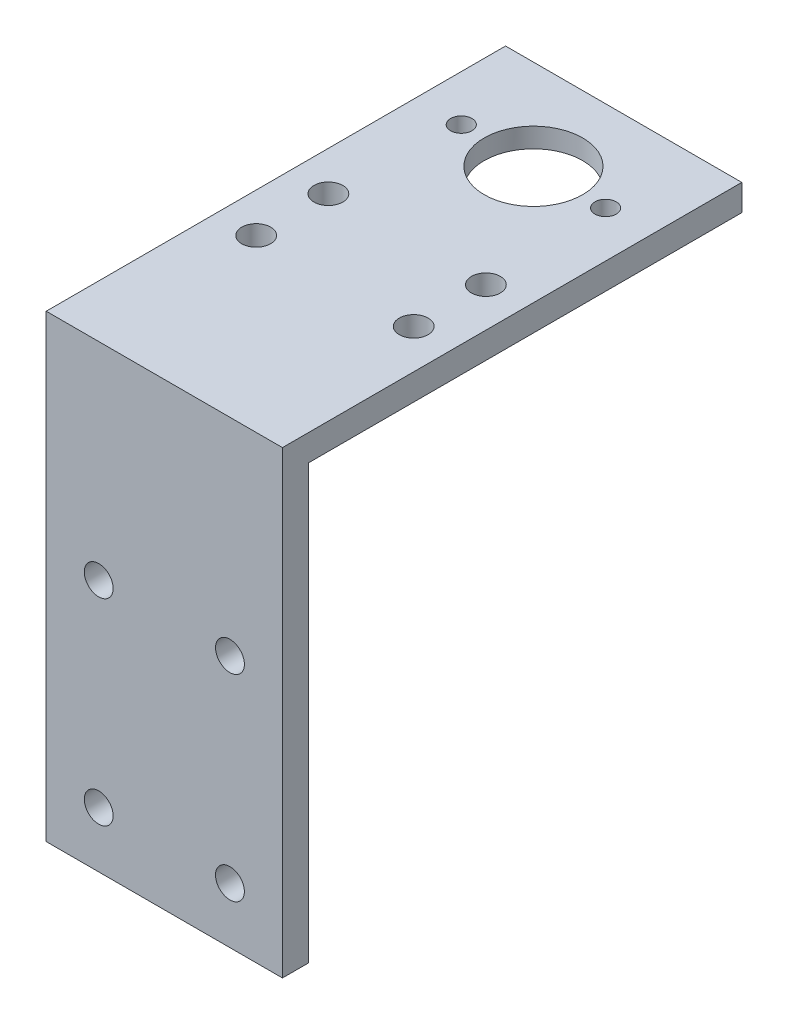
ISO-10303-21;
HEADER;
FILE_DESCRIPTION(('STEP AP214'),'2;1');
FILE_NAME('part.step','',(''),(''),'','','');
FILE_SCHEMA(('AUTOMOTIVE_DESIGN { 1 0 10303 214 1 1 1 1 }'));
ENDSEC;
DATA;
#1=APPLICATION_CONTEXT('core data for automotive mechanical design processes');
#2=APPLICATION_PROTOCOL_DEFINITION('international standard','automotive_design',2000,#1);
#3=PRODUCT_CONTEXT('',#1,'mechanical');
#4=PRODUCT('Part','Part','',(#3));
#5=PRODUCT_RELATED_PRODUCT_CATEGORY('part','',(#4));
#6=PRODUCT_DEFINITION_FORMATION('','',#4);
#7=PRODUCT_DEFINITION_CONTEXT('part definition',#1,'design');
#8=PRODUCT_DEFINITION('design','',#6,#7);
#9=PRODUCT_DEFINITION_SHAPE('','',#8);
#10=(LENGTH_UNIT() NAMED_UNIT(*) SI_UNIT(.MILLI.,.METRE.));
#11=(NAMED_UNIT(*) PLANE_ANGLE_UNIT() SI_UNIT($,.RADIAN.));
#12=(NAMED_UNIT(*) SI_UNIT($,.STERADIAN.) SOLID_ANGLE_UNIT());
#13=UNCERTAINTY_MEASURE_WITH_UNIT(LENGTH_MEASURE(1.E-05),#10,'distance_accuracy_value','');
#14=(GEOMETRIC_REPRESENTATION_CONTEXT(3) GLOBAL_UNCERTAINTY_ASSIGNED_CONTEXT((#13)) GLOBAL_UNIT_ASSIGNED_CONTEXT((#10,
#11,#12)) REPRESENTATION_CONTEXT('',''));
#15=CARTESIAN_POINT('',(0.,0.,0.));
#16=DIRECTION('',(0.,0.,1.));
#17=DIRECTION('',(1.,0.,0.));
#18=AXIS2_PLACEMENT_3D('',#15,#16,#17);
#19=CARTESIAN_POINT('',(11.,-70.,-56.25));
#20=DIRECTION('',(0.,1.,0.));
#21=DIRECTION('',(0.,0.,1.));
#22=AXIS2_PLACEMENT_3D('',#19,#20,#21);
#23=CYLINDRICAL_SURFACE('',#22,1.625);
#24=CARTESIAN_POINT('',(11.,0.,-56.25));
#25=DIRECTION('',(0.,1.,0.));
#26=DIRECTION('',(0.,0.,1.));
#27=AXIS2_PLACEMENT_3D('',#24,#25,#26);
#28=CIRCLE('',#27,1.625);
#29=CARTESIAN_POINT('',(11.,0.,-54.625));
#30=VERTEX_POINT('',#29);
#31=EDGE_CURVE('E203',#30,#30,#28,.T.);
#32=ORIENTED_EDGE('',*,*,#31,.T.);
#33=EDGE_LOOP('',(#32));
#34=FACE_BOUND('',#33,.T.);
#35=CARTESIAN_POINT('',(11.,-3.,-56.25));
#36=DIRECTION('',(0.,-1.,0.));
#37=DIRECTION('',(0.,0.,-1.));
#38=AXIS2_PLACEMENT_3D('',#35,#36,#37);
#39=CIRCLE('',#38,1.625);
#40=CARTESIAN_POINT('',(11.,-3.,-57.875));
#41=VERTEX_POINT('',#40);
#42=CARTESIAN_POINT('',(11.,-3.,-54.625));
#43=VERTEX_POINT('',#42);
#44=EDGE_CURVE('E524',#41,#43,#39,.F.);
#45=ORIENTED_EDGE('',*,*,#44,.F.);
#46=DIRECTION('',(0.,-1.,0.));
#47=VECTOR('',#46,1.);
#48=CARTESIAN_POINT('',(11.,22.458299236202,-57.875));
#49=LINE('',#48,#47);
#50=CARTESIAN_POINT('',(11.,-4.,-57.875));
#51=VERTEX_POINT('',#50);
#52=EDGE_CURVE('E160',#41,#51,#49,.T.);
#53=ORIENTED_EDGE('',*,*,#52,.T.);
#54=CARTESIAN_POINT('',(11.,-4.,-56.25));
#55=DIRECTION('',(0.,-1.,0.));
#56=DIRECTION('',(0.,0.,-1.));
#57=AXIS2_PLACEMENT_3D('',#54,#55,#56);
#58=CIRCLE('',#57,1.625);
#59=CARTESIAN_POINT('',(11.,-4.,-54.625));
#60=VERTEX_POINT('',#59);
#61=EDGE_CURVE('E194',#51,#60,#58,.T.);
#62=ORIENTED_EDGE('',*,*,#61,.T.);
#63=DIRECTION('',(0.,-1.,0.));
#64=VECTOR('',#63,1.);
#65=CARTESIAN_POINT('',(11.,22.458299236202,-54.625));
#66=LINE('',#65,#64);
#67=EDGE_CURVE('E515',#43,#60,#66,.T.);
#68=ORIENTED_EDGE('',*,*,#67,.F.);
#69=EDGE_LOOP('',(#45,#53,#62,#68));
#70=FACE_BOUND('',#69,.T.);
#71=ADVANCED_FACE('F17',(#34,#70),#23,.F.);
#72=CARTESIAN_POINT('',(0.,-3.,-56.25));
#73=DIRECTION('',(0.,-1.,0.));
#74=DIRECTION('',(0.,0.,-1.));
#75=AXIS2_PLACEMENT_3D('',#72,#73,#74);
#76=CYLINDRICAL_SURFACE('',#75,9.);
#77=CARTESIAN_POINT('',(0.,-4.,-56.25));
#78=DIRECTION('',(0.,-1.,0.));
#79=DIRECTION('',(0.,0.,-1.));
#80=AXIS2_PLACEMENT_3D('',#77,#78,#79);
#81=CIRCLE('',#80,9.);
#82=CARTESIAN_POINT('',(8.85208308817761,-4.,-54.625));
#83=VERTEX_POINT('',#82);
#84=CARTESIAN_POINT('',(-8.85208308817761,-4.,-54.625));
#85=VERTEX_POINT('',#84);
#86=EDGE_CURVE('E225',#83,#85,#81,.T.);
#87=ORIENTED_EDGE('',*,*,#86,.T.);
#88=DIRECTION('',(0.,-1.,0.));
#89=VECTOR('',#88,1.);
#90=CARTESIAN_POINT('',(-8.8520830881776,-3.,-54.625));
#91=LINE('',#90,#89);
#92=CARTESIAN_POINT('',(-8.8520830881776,-3.,-54.625));
#93=VERTEX_POINT('',#92);
#94=EDGE_CURVE('E11',#85,#93,#91,.F.);
#95=ORIENTED_EDGE('',*,*,#94,.T.);
#96=CARTESIAN_POINT('',(0.,-3.,-56.25));
#97=DIRECTION('',(0.,-1.,0.));
#98=DIRECTION('',(0.,0.,-1.));
#99=AXIS2_PLACEMENT_3D('',#96,#97,#98);
#100=CIRCLE('',#99,9.);
#101=CARTESIAN_POINT('',(8.8520830881776,-3.,-54.625));
#102=VERTEX_POINT('',#101);
#103=EDGE_CURVE('E209',#102,#93,#100,.T.);
#104=ORIENTED_EDGE('',*,*,#103,.F.);
#105=DIRECTION('',(0.,-1.,0.));
#106=VECTOR('',#105,1.);
#107=CARTESIAN_POINT('',(8.8520830881776,-3.,-54.625));
#108=LINE('',#107,#106);
#109=EDGE_CURVE('E26',#102,#83,#108,.T.);
#110=ORIENTED_EDGE('',*,*,#109,.T.);
#111=EDGE_LOOP('',(#87,#95,#104,#110));
#112=FACE_BOUND('',#111,.T.);
#113=ADVANCED_FACE('F224',(#112),#76,.F.);
#114=CARTESIAN_POINT('',(0.,-70.,-56.25));
#115=DIRECTION('',(0.,1.,0.));
#116=DIRECTION('',(0.,0.,1.));
#117=AXIS2_PLACEMENT_3D('',#114,#115,#116);
#118=CYLINDRICAL_SURFACE('',#117,7.5);
#119=CARTESIAN_POINT('',(0.,0.,-56.25));
#120=DIRECTION('',(0.,1.,0.));
#121=DIRECTION('',(0.,0.,1.));
#122=AXIS2_PLACEMENT_3D('',#119,#120,#121);
#123=CIRCLE('',#122,7.5);
#124=CARTESIAN_POINT('',(0.,0.,-48.75));
#125=VERTEX_POINT('',#124);
#126=EDGE_CURVE('E184',#125,#125,#123,.T.);
#127=ORIENTED_EDGE('',*,*,#126,.T.);
#128=EDGE_LOOP('',(#127));
#129=FACE_BOUND('',#128,.T.);
#130=CARTESIAN_POINT('',(0.,-3.,-56.25));
#131=DIRECTION('',(0.,-1.,0.));
#132=DIRECTION('',(0.,0.,-1.));
#133=AXIS2_PLACEMENT_3D('',#130,#131,#132);
#134=CIRCLE('',#133,7.5);
#135=CARTESIAN_POINT('',(0.,-3.,-63.75));
#136=VERTEX_POINT('',#135);
#137=EDGE_CURVE('E204',#136,#136,#134,.F.);
#138=ORIENTED_EDGE('',*,*,#137,.F.);
#139=EDGE_LOOP('',(#138));
#140=FACE_BOUND('',#139,.T.);
#141=ADVANCED_FACE('F408',(#129,#140),#118,.F.);
#142=CARTESIAN_POINT('',(-18.,-70.,0.));
#143=DIRECTION('',(0.,0.,1.));
#144=DIRECTION('',(1.,0.,0.));
#145=AXIS2_PLACEMENT_3D('',#142,#143,#144);
#146=PLANE('',#145);
#147=CARTESIAN_POINT('',(-10.,-31.5,0.));
#148=DIRECTION('',(0.,0.,-1.));
#149=DIRECTION('',(0.,1.,0.));
#150=AXIS2_PLACEMENT_3D('',#147,#148,#149);
#151=CIRCLE('',#150,2.2);
#152=CARTESIAN_POINT('',(-10.,-29.3,0.));
#153=VERTEX_POINT('',#152);
#154=EDGE_CURVE('E238',#153,#153,#151,.T.);
#155=ORIENTED_EDGE('',*,*,#154,.T.);
#156=EDGE_LOOP('',(#155));
#157=FACE_BOUND('',#156,.T.);
#158=CARTESIAN_POINT('',(10.,-31.5,0.));
#159=DIRECTION('',(0.,0.,-1.));
#160=DIRECTION('',(0.,1.,0.));
#161=AXIS2_PLACEMENT_3D('',#158,#159,#160);
#162=CIRCLE('',#161,2.2);
#163=CARTESIAN_POINT('',(10.,-29.3,0.));
#164=VERTEX_POINT('',#163);
#165=EDGE_CURVE('E246',#164,#164,#162,.T.);
#166=ORIENTED_EDGE('',*,*,#165,.T.);
#167=EDGE_LOOP('',(#166));
#168=FACE_BOUND('',#167,.T.);
#169=CARTESIAN_POINT('',(-10.,-61.5,0.));
#170=DIRECTION('',(0.,0.,-1.));
#171=DIRECTION('',(0.,1.,0.));
#172=AXIS2_PLACEMENT_3D('',#169,#170,#171);
#173=CIRCLE('',#172,2.2);
#174=CARTESIAN_POINT('',(-10.,-59.3,0.));
#175=VERTEX_POINT('',#174);
#176=EDGE_CURVE('E254',#175,#175,#173,.T.);
#177=ORIENTED_EDGE('',*,*,#176,.T.);
#178=EDGE_LOOP('',(#177));
#179=FACE_BOUND('',#178,.T.);
#180=CARTESIAN_POINT('',(10.,-61.5,0.));
#181=DIRECTION('',(0.,0.,-1.));
#182=DIRECTION('',(0.,1.,0.));
#183=AXIS2_PLACEMENT_3D('',#180,#181,#182);
#184=CIRCLE('',#183,2.2);
#185=CARTESIAN_POINT('',(10.,-59.3,0.));
#186=VERTEX_POINT('',#185);
#187=EDGE_CURVE('E262',#186,#186,#184,.T.);
#188=ORIENTED_EDGE('',*,*,#187,.T.);
#189=EDGE_LOOP('',(#188));
#190=FACE_BOUND('',#189,.T.);
#191=DIRECTION('',(1.,0.,0.));
#192=VECTOR('',#191,1.);
#193=CARTESIAN_POINT('',(-18.,-70.,0.));
#194=LINE('',#193,#192);
#195=CARTESIAN_POINT('',(-18.,-70.,0.));
#196=VERTEX_POINT('',#195);
#197=CARTESIAN_POINT('',(18.,-70.,0.));
#198=VERTEX_POINT('',#197);
#199=EDGE_CURVE('E198',#196,#198,#194,.T.);
#200=ORIENTED_EDGE('',*,*,#199,.T.);
#201=DIRECTION('',(0.,-1.,0.));
#202=VECTOR('',#201,1.);
#203=CARTESIAN_POINT('',(18.,-70.,0.));
#204=LINE('',#203,#202);
#205=CARTESIAN_POINT('',(18.,0.,0.));
#206=VERTEX_POINT('',#205);
#207=EDGE_CURVE('E300',#206,#198,#204,.T.);
#208=ORIENTED_EDGE('',*,*,#207,.F.);
#209=DIRECTION('',(1.,0.,0.));
#210=VECTOR('',#209,1.);
#211=CARTESIAN_POINT('',(-18.,0.,0.));
#212=LINE('',#211,#210);
#213=CARTESIAN_POINT('',(-18.,0.,0.));
#214=VERTEX_POINT('',#213);
#215=EDGE_CURVE('E214',#214,#206,#212,.T.);
#216=ORIENTED_EDGE('',*,*,#215,.F.);
#217=DIRECTION('',(0.,-1.,0.));
#218=VECTOR('',#217,1.);
#219=CARTESIAN_POINT('',(-18.,-70.,0.));
#220=LINE('',#219,#218);
#221=EDGE_CURVE('E327',#214,#196,#220,.T.);
#222=ORIENTED_EDGE('',*,*,#221,.T.);
#223=EDGE_LOOP('',(#200,#208,#216,#222));
#224=FACE_BOUND('',#223,.T.);
#225=ADVANCED_FACE('F19',(#157,#168,#179,#190,#224),#146,.T.);
#226=CARTESIAN_POINT('',(-18.,0.,0.));
#227=DIRECTION('',(0.,1.,0.));
#228=DIRECTION('',(0.,0.,1.));
#229=AXIS2_PLACEMENT_3D('',#226,#227,#228);
#230=PLANE('',#229);
#231=ORIENTED_EDGE('',*,*,#31,.F.);
#232=EDGE_LOOP('',(#231));
#233=FACE_BOUND('',#232,.T.);
#234=CARTESIAN_POINT('',(-11.,0.,-56.25));
#235=DIRECTION('',(0.,1.,0.));
#236=DIRECTION('',(0.,0.,1.));
#237=AXIS2_PLACEMENT_3D('',#234,#235,#236);
#238=CIRCLE('',#237,1.625);
#239=CARTESIAN_POINT('',(-11.,0.,-54.625));
#240=VERTEX_POINT('',#239);
#241=EDGE_CURVE('E185',#240,#240,#238,.T.);
#242=ORIENTED_EDGE('',*,*,#241,.F.);
#243=EDGE_LOOP('',(#242));
#244=FACE_BOUND('',#243,.T.);
#245=ORIENTED_EDGE('',*,*,#126,.F.);
#246=EDGE_LOOP('',(#245));
#247=FACE_BOUND('',#246,.T.);
#248=CARTESIAN_POINT('',(-12.,0.,-26.));
#249=DIRECTION('',(0.,-1.,0.));
#250=DIRECTION('',(0.,0.,1.));
#251=AXIS2_PLACEMENT_3D('',#248,#249,#250);
#252=CIRCLE('',#251,2.2);
#253=CARTESIAN_POINT('',(-12.,0.,-23.8));
#254=VERTEX_POINT('',#253);
#255=EDGE_CURVE('E272',#254,#254,#252,.T.);
#256=ORIENTED_EDGE('',*,*,#255,.T.);
#257=EDGE_LOOP('',(#256));
#258=FACE_BOUND('',#257,.T.);
#259=CARTESIAN_POINT('',(-12.,0.,-37.));
#260=DIRECTION('',(0.,-1.,0.));
#261=DIRECTION('',(0.,0.,1.));
#262=AXIS2_PLACEMENT_3D('',#259,#260,#261);
#263=CIRCLE('',#262,2.2);
#264=CARTESIAN_POINT('',(-12.,0.,-34.8));
#265=VERTEX_POINT('',#264);
#266=EDGE_CURVE('E280',#265,#265,#263,.T.);
#267=ORIENTED_EDGE('',*,*,#266,.T.);
#268=EDGE_LOOP('',(#267));
#269=FACE_BOUND('',#268,.T.);
#270=CARTESIAN_POINT('',(12.,0.,-37.));
#271=DIRECTION('',(0.,-1.,0.));
#272=DIRECTION('',(0.,0.,-1.));
#273=AXIS2_PLACEMENT_3D('',#270,#271,#272);
#274=CIRCLE('',#273,2.2);
#275=CARTESIAN_POINT('',(12.,0.,-39.2));
#276=VERTEX_POINT('',#275);
#277=EDGE_CURVE('E288',#276,#276,#274,.T.);
#278=ORIENTED_EDGE('',*,*,#277,.T.);
#279=EDGE_LOOP('',(#278));
#280=FACE_BOUND('',#279,.T.);
#281=CARTESIAN_POINT('',(12.,0.,-26.));
#282=DIRECTION('',(0.,-1.,0.));
#283=DIRECTION('',(0.,0.,-1.));
#284=AXIS2_PLACEMENT_3D('',#281,#282,#283);
#285=CIRCLE('',#284,2.2);
#286=CARTESIAN_POINT('',(12.,0.,-28.2));
#287=VERTEX_POINT('',#286);
#288=EDGE_CURVE('E296',#287,#287,#285,.T.);
#289=ORIENTED_EDGE('',*,*,#288,.T.);
#290=EDGE_LOOP('',(#289));
#291=FACE_BOUND('',#290,.T.);
#292=ORIENTED_EDGE('',*,*,#215,.T.);
#293=DIRECTION('',(0.,0.,1.));
#294=VECTOR('',#293,1.);
#295=CARTESIAN_POINT('',(18.,0.,0.));
#296=LINE('',#295,#294);
#297=CARTESIAN_POINT('',(18.,0.,-70.));
#298=VERTEX_POINT('',#297);
#299=EDGE_CURVE('E323',#298,#206,#296,.T.);
#300=ORIENTED_EDGE('',*,*,#299,.F.);
#301=DIRECTION('',(1.,0.,0.));
#302=VECTOR('',#301,1.);
#303=CARTESIAN_POINT('',(-18.,0.,-70.));
#304=LINE('',#303,#302);
#305=CARTESIAN_POINT('',(-18.,0.,-70.));
#306=VERTEX_POINT('',#305);
#307=EDGE_CURVE('E353',#306,#298,#304,.T.);
#308=ORIENTED_EDGE('',*,*,#307,.F.);
#309=DIRECTION('',(0.,0.,1.));
#310=VECTOR('',#309,1.);
#311=CARTESIAN_POINT('',(-18.,0.,0.));
#312=LINE('',#311,#310);
#313=EDGE_CURVE('E347',#306,#214,#312,.T.);
#314=ORIENTED_EDGE('',*,*,#313,.T.);
#315=EDGE_LOOP('',(#292,#300,#308,#314));
#316=FACE_BOUND('',#315,.T.);
#317=ADVANCED_FACE('F379',(#233,#244,#247,#258,#269,#280,#291,#316),#230,.T.);
#318=CARTESIAN_POINT('',(-18.,0.,-70.));
#319=DIRECTION('',(0.,0.,-1.));
#320=DIRECTION('',(-1.,0.,0.));
#321=AXIS2_PLACEMENT_3D('',#318,#319,#320);
#322=PLANE('',#321);
#323=ORIENTED_EDGE('',*,*,#307,.T.);
#324=DIRECTION('',(0.,1.,0.));
#325=VECTOR('',#324,1.);
#326=CARTESIAN_POINT('',(18.,0.,-70.));
#327=LINE('',#326,#325);
#328=CARTESIAN_POINT('',(18.,-4.,-70.));
#329=VERTEX_POINT('',#328);
#330=EDGE_CURVE('E319',#329,#298,#327,.T.);
#331=ORIENTED_EDGE('',*,*,#330,.F.);
#332=DIRECTION('',(1.,0.,0.));
#333=VECTOR('',#332,1.);
#334=CARTESIAN_POINT('',(-18.,-4.,-70.));
#335=LINE('',#334,#333);
#336=CARTESIAN_POINT('',(-18.,-4.,-70.));
#337=VERTEX_POINT('',#336);
#338=EDGE_CURVE('E356',#337,#329,#335,.T.);
#339=ORIENTED_EDGE('',*,*,#338,.F.);
#340=DIRECTION('',(0.,1.,0.));
#341=VECTOR('',#340,1.);
#342=CARTESIAN_POINT('',(-18.,0.,-70.));
#343=LINE('',#342,#341);
#344=EDGE_CURVE('E343',#337,#306,#343,.T.);
#345=ORIENTED_EDGE('',*,*,#344,.T.);
#346=EDGE_LOOP('',(#323,#331,#339,#345));
#347=FACE_BOUND('',#346,.T.);
#348=ADVANCED_FACE('F391',(#347),#322,.T.);
#349=CARTESIAN_POINT('',(-18.,-4.,-70.));
#350=DIRECTION('',(0.,-1.,0.));
#351=DIRECTION('',(0.,0.,-1.));
#352=AXIS2_PLACEMENT_3D('',#349,#350,#351);
#353=PLANE('',#352);
#354=DIRECTION('',(-1.,0.,0.));
#355=VECTOR('',#354,1.);
#356=CARTESIAN_POINT('',(-11.,-4.,-54.625));
#357=LINE('',#356,#355);
#358=EDGE_CURVE('E161',#60,#83,#357,.T.);
#359=ORIENTED_EDGE('',*,*,#358,.F.);
#360=ORIENTED_EDGE('',*,*,#61,.F.);
#361=DIRECTION('',(1.,0.,0.));
#362=VECTOR('',#361,1.);
#363=CARTESIAN_POINT('',(-11.,-4.,-57.875));
#364=LINE('',#363,#362);
#365=CARTESIAN_POINT('',(8.85208308817761,-4.,-57.875));
#366=VERTEX_POINT('',#365);
#367=EDGE_CURVE('E176',#366,#51,#364,.T.);
#368=ORIENTED_EDGE('',*,*,#367,.F.);
#369=CARTESIAN_POINT('',(-8.85208308817761,-4.,-57.875));
#370=VERTEX_POINT('',#369);
#371=EDGE_CURVE('E173',#370,#366,#81,.T.);
#372=ORIENTED_EDGE('',*,*,#371,.F.);
#373=CARTESIAN_POINT('',(-11.,-4.,-57.875));
#374=VERTEX_POINT('',#373);
#375=EDGE_CURVE('E154',#374,#370,#364,.T.);
#376=ORIENTED_EDGE('',*,*,#375,.F.);
#377=CARTESIAN_POINT('',(-11.,-4.,-56.25));
#378=DIRECTION('',(0.,-1.,0.));
#379=DIRECTION('',(0.,0.,-1.));
#380=AXIS2_PLACEMENT_3D('',#377,#378,#379);
#381=CIRCLE('',#380,1.625);
#382=CARTESIAN_POINT('',(-11.,-4.,-54.625));
#383=VERTEX_POINT('',#382);
#384=EDGE_CURVE('E170',#383,#374,#381,.T.);
#385=ORIENTED_EDGE('',*,*,#384,.F.);
#386=EDGE_CURVE('E175',#85,#383,#357,.T.);
#387=ORIENTED_EDGE('',*,*,#386,.F.);
#388=ORIENTED_EDGE('',*,*,#86,.F.);
#389=EDGE_LOOP('',(#359,#360,#368,#372,#376,#385,#387,#388));
#390=FACE_BOUND('',#389,.T.);
#391=CARTESIAN_POINT('',(-12.,-4.,-26.));
#392=DIRECTION('',(0.,-1.,0.));
#393=DIRECTION('',(0.,0.,1.));
#394=AXIS2_PLACEMENT_3D('',#391,#392,#393);
#395=CIRCLE('',#394,2.2);
#396=CARTESIAN_POINT('',(-12.,-4.,-23.8));
#397=VERTEX_POINT('',#396);
#398=EDGE_CURVE('E191',#397,#397,#395,.T.);
#399=ORIENTED_EDGE('',*,*,#398,.F.);
#400=EDGE_LOOP('',(#399));
#401=FACE_BOUND('',#400,.T.);
#402=CARTESIAN_POINT('',(-12.,-4.,-37.));
#403=DIRECTION('',(0.,-1.,0.));
#404=DIRECTION('',(0.,0.,1.));
#405=AXIS2_PLACEMENT_3D('',#402,#403,#404);
#406=CIRCLE('',#405,2.2);
#407=CARTESIAN_POINT('',(-12.,-4.,-34.8));
#408=VERTEX_POINT('',#407);
#409=EDGE_CURVE('E276',#408,#408,#406,.T.);
#410=ORIENTED_EDGE('',*,*,#409,.F.);
#411=EDGE_LOOP('',(#410));
#412=FACE_BOUND('',#411,.T.);
#413=CARTESIAN_POINT('',(12.,-4.,-37.));
#414=DIRECTION('',(0.,-1.,0.));
#415=DIRECTION('',(0.,0.,-1.));
#416=AXIS2_PLACEMENT_3D('',#413,#414,#415);
#417=CIRCLE('',#416,2.2);
#418=CARTESIAN_POINT('',(12.,-4.,-39.2));
#419=VERTEX_POINT('',#418);
#420=EDGE_CURVE('E284',#419,#419,#417,.T.);
#421=ORIENTED_EDGE('',*,*,#420,.F.);
#422=EDGE_LOOP('',(#421));
#423=FACE_BOUND('',#422,.T.);
#424=CARTESIAN_POINT('',(12.,-4.,-26.));
#425=DIRECTION('',(0.,-1.,0.));
#426=DIRECTION('',(0.,0.,-1.));
#427=AXIS2_PLACEMENT_3D('',#424,#425,#426);
#428=CIRCLE('',#427,2.2);
#429=CARTESIAN_POINT('',(12.,-4.,-28.2));
#430=VERTEX_POINT('',#429);
#431=EDGE_CURVE('E292',#430,#430,#428,.T.);
#432=ORIENTED_EDGE('',*,*,#431,.F.);
#433=EDGE_LOOP('',(#432));
#434=FACE_BOUND('',#433,.T.);
#435=ORIENTED_EDGE('',*,*,#338,.T.);
#436=DIRECTION('',(0.,0.,-1.));
#437=VECTOR('',#436,1.);
#438=CARTESIAN_POINT('',(18.,-4.,-70.));
#439=LINE('',#438,#437);
#440=CARTESIAN_POINT('',(18.,-4.,-4.));
#441=VERTEX_POINT('',#440);
#442=EDGE_CURVE('E315',#441,#329,#439,.T.);
#443=ORIENTED_EDGE('',*,*,#442,.F.);
#444=DIRECTION('',(1.,0.,0.));
#445=VECTOR('',#444,1.);
#446=CARTESIAN_POINT('',(-18.,-4.,-4.));
#447=LINE('',#446,#445);
#448=CARTESIAN_POINT('',(-18.,-4.,-4.));
#449=VERTEX_POINT('',#448);
#450=EDGE_CURVE('E359',#449,#441,#447,.T.);
#451=ORIENTED_EDGE('',*,*,#450,.F.);
#452=DIRECTION('',(0.,0.,-1.));
#453=VECTOR('',#452,1.);
#454=CARTESIAN_POINT('',(-18.,-4.,-70.));
#455=LINE('',#454,#453);
#456=EDGE_CURVE('E339',#449,#337,#455,.T.);
#457=ORIENTED_EDGE('',*,*,#456,.T.);
#458=EDGE_LOOP('',(#435,#443,#451,#457));
#459=FACE_BOUND('',#458,.T.);
#460=ADVANCED_FACE('F167',(#390,#401,#412,#423,#434,#459),#353,.T.);
#461=CARTESIAN_POINT('',(-18.,-4.,-4.));
#462=DIRECTION('',(0.,0.,-1.));
#463=DIRECTION('',(0.,1.,0.));
#464=AXIS2_PLACEMENT_3D('',#461,#462,#463);
#465=PLANE('',#464);
#466=CARTESIAN_POINT('',(-10.,-31.5,-4.));
#467=DIRECTION('',(0.,0.,-1.));
#468=DIRECTION('',(0.,1.,0.));
#469=AXIS2_PLACEMENT_3D('',#466,#467,#468);
#470=CIRCLE('',#469,2.2);
#471=CARTESIAN_POINT('',(-10.,-29.3,-4.));
#472=VERTEX_POINT('',#471);
#473=EDGE_CURVE('E208',#472,#472,#470,.T.);
#474=ORIENTED_EDGE('',*,*,#473,.F.);
#475=EDGE_LOOP('',(#474));
#476=FACE_BOUND('',#475,.T.);
#477=CARTESIAN_POINT('',(10.,-31.5,-4.));
#478=DIRECTION('',(0.,0.,-1.));
#479=DIRECTION('',(0.,1.,0.));
#480=AXIS2_PLACEMENT_3D('',#477,#478,#479);
#481=CIRCLE('',#480,2.2);
#482=CARTESIAN_POINT('',(10.,-29.3,-4.));
#483=VERTEX_POINT('',#482);
#484=EDGE_CURVE('E242',#483,#483,#481,.T.);
#485=ORIENTED_EDGE('',*,*,#484,.F.);
#486=EDGE_LOOP('',(#485));
#487=FACE_BOUND('',#486,.T.);
#488=CARTESIAN_POINT('',(-10.,-61.5,-4.));
#489=DIRECTION('',(0.,0.,-1.));
#490=DIRECTION('',(0.,1.,0.));
#491=AXIS2_PLACEMENT_3D('',#488,#489,#490);
#492=CIRCLE('',#491,2.2);
#493=CARTESIAN_POINT('',(-10.,-59.3,-4.));
#494=VERTEX_POINT('',#493);
#495=EDGE_CURVE('E250',#494,#494,#492,.T.);
#496=ORIENTED_EDGE('',*,*,#495,.F.);
#497=EDGE_LOOP('',(#496));
#498=FACE_BOUND('',#497,.T.);
#499=CARTESIAN_POINT('',(10.,-61.5,-4.));
#500=DIRECTION('',(0.,0.,-1.));
#501=DIRECTION('',(0.,1.,0.));
#502=AXIS2_PLACEMENT_3D('',#499,#500,#501);
#503=CIRCLE('',#502,2.2);
#504=CARTESIAN_POINT('',(10.,-59.3,-4.));
#505=VERTEX_POINT('',#504);
#506=EDGE_CURVE('E258',#505,#505,#503,.T.);
#507=ORIENTED_EDGE('',*,*,#506,.F.);
#508=EDGE_LOOP('',(#507));
#509=FACE_BOUND('',#508,.T.);
#510=ORIENTED_EDGE('',*,*,#450,.T.);
#511=DIRECTION('',(0.,1.,0.));
#512=VECTOR('',#511,1.);
#513=CARTESIAN_POINT('',(18.,-4.,-4.));
#514=LINE('',#513,#512);
#515=CARTESIAN_POINT('',(18.,-70.,-4.));
#516=VERTEX_POINT('',#515);
#517=EDGE_CURVE('E311',#516,#441,#514,.T.);
#518=ORIENTED_EDGE('',*,*,#517,.F.);
#519=DIRECTION('',(1.,0.,0.));
#520=VECTOR('',#519,1.);
#521=CARTESIAN_POINT('',(-18.,-70.,-4.));
#522=LINE('',#521,#520);
#523=CARTESIAN_POINT('',(-18.,-70.,-4.));
#524=VERTEX_POINT('',#523);
#525=EDGE_CURVE('E361',#524,#516,#522,.T.);
#526=ORIENTED_EDGE('',*,*,#525,.F.);
#527=DIRECTION('',(0.,1.,0.));
#528=VECTOR('',#527,1.);
#529=CARTESIAN_POINT('',(-18.,-4.,-4.));
#530=LINE('',#529,#528);
#531=EDGE_CURVE('E335',#524,#449,#530,.T.);
#532=ORIENTED_EDGE('',*,*,#531,.T.);
#533=EDGE_LOOP('',(#510,#518,#526,#532));
#534=FACE_BOUND('',#533,.T.);
#535=ADVANCED_FACE('F387',(#476,#487,#498,#509,#534),#465,.T.);
#536=CARTESIAN_POINT('',(-18.,-70.,-4.));
#537=DIRECTION('',(0.,-1.,0.));
#538=DIRECTION('',(0.,0.,-1.));
#539=AXIS2_PLACEMENT_3D('',#536,#537,#538);
#540=PLANE('',#539);
#541=ORIENTED_EDGE('',*,*,#525,.T.);
#542=DIRECTION('',(0.,0.,-1.));
#543=VECTOR('',#542,1.);
#544=CARTESIAN_POINT('',(18.,-70.,-4.));
#545=LINE('',#544,#543);
#546=EDGE_CURVE('E307',#198,#516,#545,.T.);
#547=ORIENTED_EDGE('',*,*,#546,.F.);
#548=ORIENTED_EDGE('',*,*,#199,.F.);
#549=DIRECTION('',(0.,0.,-1.));
#550=VECTOR('',#549,1.);
#551=CARTESIAN_POINT('',(-18.,-70.,-4.));
#552=LINE('',#551,#550);
#553=EDGE_CURVE('E331',#196,#524,#552,.T.);
#554=ORIENTED_EDGE('',*,*,#553,.T.);
#555=EDGE_LOOP('',(#541,#547,#548,#554));
#556=FACE_BOUND('',#555,.T.);
#557=ADVANCED_FACE('F372',(#556),#540,.T.);
#558=CARTESIAN_POINT('',(-18.,0.,0.));
#559=DIRECTION('',(-1.,0.,0.));
#560=DIRECTION('',(0.,0.,1.));
#561=AXIS2_PLACEMENT_3D('',#558,#559,#560);
#562=PLANE('',#561);
#563=ORIENTED_EDGE('',*,*,#221,.F.);
#564=ORIENTED_EDGE('',*,*,#313,.F.);
#565=ORIENTED_EDGE('',*,*,#344,.F.);
#566=ORIENTED_EDGE('',*,*,#456,.F.);
#567=ORIENTED_EDGE('',*,*,#531,.F.);
#568=ORIENTED_EDGE('',*,*,#553,.F.);
#569=EDGE_LOOP('',(#563,#564,#565,#566,#567,#568));
#570=FACE_BOUND('',#569,.T.);
#571=ADVANCED_FACE('F382',(#570),#562,.T.);
#572=CARTESIAN_POINT('',(18.,0.,0.));
#573=DIRECTION('',(-1.,0.,0.));
#574=DIRECTION('',(0.,0.,1.));
#575=AXIS2_PLACEMENT_3D('',#572,#573,#574);
#576=PLANE('',#575);
#577=ORIENTED_EDGE('',*,*,#207,.T.);
#578=ORIENTED_EDGE('',*,*,#546,.T.);
#579=ORIENTED_EDGE('',*,*,#517,.T.);
#580=ORIENTED_EDGE('',*,*,#442,.T.);
#581=ORIENTED_EDGE('',*,*,#330,.T.);
#582=ORIENTED_EDGE('',*,*,#299,.T.);
#583=EDGE_LOOP('',(#577,#578,#579,#580,#581,#582));
#584=FACE_BOUND('',#583,.T.);
#585=ADVANCED_FACE('F375',(#584),#576,.F.);
#586=CARTESIAN_POINT('',(12.,0.,-26.));
#587=DIRECTION('',(0.,-1.,0.));
#588=DIRECTION('',(0.,0.,-1.));
#589=AXIS2_PLACEMENT_3D('',#586,#587,#588);
#590=CYLINDRICAL_SURFACE('',#589,2.2);
#591=ORIENTED_EDGE('',*,*,#288,.F.);
#592=EDGE_LOOP('',(#591));
#593=FACE_BOUND('',#592,.T.);
#594=ORIENTED_EDGE('',*,*,#431,.T.);
#595=EDGE_LOOP('',(#594));
#596=FACE_BOUND('',#595,.T.);
#597=ADVANCED_FACE('F432',(#593,#596),#590,.F.);
#598=CARTESIAN_POINT('',(12.,0.,-37.));
#599=DIRECTION('',(0.,-1.,0.));
#600=DIRECTION('',(0.,0.,-1.));
#601=AXIS2_PLACEMENT_3D('',#598,#599,#600);
#602=CYLINDRICAL_SURFACE('',#601,2.2);
#603=ORIENTED_EDGE('',*,*,#277,.F.);
#604=EDGE_LOOP('',(#603));
#605=FACE_BOUND('',#604,.T.);
#606=ORIENTED_EDGE('',*,*,#420,.T.);
#607=EDGE_LOOP('',(#606));
#608=FACE_BOUND('',#607,.T.);
#609=ADVANCED_FACE('F428',(#605,#608),#602,.F.);
#610=CARTESIAN_POINT('',(-12.,0.,-37.));
#611=DIRECTION('',(0.,-1.,0.));
#612=DIRECTION('',(0.,0.,-1.));
#613=AXIS2_PLACEMENT_3D('',#610,#611,#612);
#614=CYLINDRICAL_SURFACE('',#613,2.2);
#615=ORIENTED_EDGE('',*,*,#266,.F.);
#616=EDGE_LOOP('',(#615));
#617=FACE_BOUND('',#616,.T.);
#618=ORIENTED_EDGE('',*,*,#409,.T.);
#619=EDGE_LOOP('',(#618));
#620=FACE_BOUND('',#619,.T.);
#621=ADVANCED_FACE('F424',(#617,#620),#614,.F.);
#622=CARTESIAN_POINT('',(-12.,0.,-26.));
#623=DIRECTION('',(0.,-1.,0.));
#624=DIRECTION('',(0.,0.,-1.));
#625=AXIS2_PLACEMENT_3D('',#622,#623,#624);
#626=CYLINDRICAL_SURFACE('',#625,2.2);
#627=ORIENTED_EDGE('',*,*,#255,.F.);
#628=EDGE_LOOP('',(#627));
#629=FACE_BOUND('',#628,.T.);
#630=ORIENTED_EDGE('',*,*,#398,.T.);
#631=EDGE_LOOP('',(#630));
#632=FACE_BOUND('',#631,.T.);
#633=ADVANCED_FACE('F418',(#629,#632),#626,.F.);
#634=CARTESIAN_POINT('',(-11.,-70.,-56.25));
#635=DIRECTION('',(0.,1.,0.));
#636=DIRECTION('',(0.,0.,1.));
#637=AXIS2_PLACEMENT_3D('',#634,#635,#636);
#638=CYLINDRICAL_SURFACE('',#637,1.625);
#639=DIRECTION('',(0.,-1.,0.));
#640=VECTOR('',#639,1.);
#641=CARTESIAN_POINT('',(-11.,22.458299236202,-57.875));
#642=LINE('',#641,#640);
#643=CARTESIAN_POINT('',(-11.,-3.,-57.875));
#644=VERTEX_POINT('',#643);
#645=EDGE_CURVE('E151',#644,#374,#642,.T.);
#646=ORIENTED_EDGE('',*,*,#645,.F.);
#647=CARTESIAN_POINT('',(-11.,-3.,-56.25));
#648=DIRECTION('',(0.,-1.,0.));
#649=DIRECTION('',(0.,0.,-1.));
#650=AXIS2_PLACEMENT_3D('',#647,#648,#649);
#651=CIRCLE('',#650,1.625);
#652=CARTESIAN_POINT('',(-11.,-3.,-54.625));
#653=VERTEX_POINT('',#652);
#654=EDGE_CURVE('E235',#653,#644,#651,.F.);
#655=ORIENTED_EDGE('',*,*,#654,.F.);
#656=DIRECTION('',(0.,-1.,0.));
#657=VECTOR('',#656,1.);
#658=CARTESIAN_POINT('',(-11.,22.458299236202,-54.625));
#659=LINE('',#658,#657);
#660=EDGE_CURVE('E182',#653,#383,#659,.T.);
#661=ORIENTED_EDGE('',*,*,#660,.T.);
#662=ORIENTED_EDGE('',*,*,#384,.T.);
#663=EDGE_LOOP('',(#646,#655,#661,#662));
#664=FACE_BOUND('',#663,.T.);
#665=ORIENTED_EDGE('',*,*,#241,.T.);
#666=EDGE_LOOP('',(#665));
#667=FACE_BOUND('',#666,.T.);
#668=ADVANCED_FACE('F179',(#664,#667),#638,.F.);
#669=CARTESIAN_POINT('',(10.,-61.5,0.));
#670=DIRECTION('',(0.,0.,-1.));
#671=DIRECTION('',(0.,1.,0.));
#672=AXIS2_PLACEMENT_3D('',#669,#670,#671);
#673=CYLINDRICAL_SURFACE('',#672,2.2);
#674=ORIENTED_EDGE('',*,*,#187,.F.);
#675=EDGE_LOOP('',(#674));
#676=FACE_BOUND('',#675,.T.);
#677=ORIENTED_EDGE('',*,*,#506,.T.);
#678=EDGE_LOOP('',(#677));
#679=FACE_BOUND('',#678,.T.);
#680=ADVANCED_FACE('F414',(#676,#679),#673,.F.);
#681=CARTESIAN_POINT('',(-10.,-61.5,0.));
#682=DIRECTION('',(0.,0.,-1.));
#683=DIRECTION('',(0.,1.,0.));
#684=AXIS2_PLACEMENT_3D('',#681,#682,#683);
#685=CYLINDRICAL_SURFACE('',#684,2.2);
#686=ORIENTED_EDGE('',*,*,#176,.F.);
#687=EDGE_LOOP('',(#686));
#688=FACE_BOUND('',#687,.T.);
#689=ORIENTED_EDGE('',*,*,#495,.T.);
#690=EDGE_LOOP('',(#689));
#691=FACE_BOUND('',#690,.T.);
#692=ADVANCED_FACE('F459',(#688,#691),#685,.F.);
#693=CARTESIAN_POINT('',(10.,-31.5,0.));
#694=DIRECTION('',(0.,0.,-1.));
#695=DIRECTION('',(0.,1.,0.));
#696=AXIS2_PLACEMENT_3D('',#693,#694,#695);
#697=CYLINDRICAL_SURFACE('',#696,2.2);
#698=ORIENTED_EDGE('',*,*,#165,.F.);
#699=EDGE_LOOP('',(#698));
#700=FACE_BOUND('',#699,.T.);
#701=ORIENTED_EDGE('',*,*,#484,.T.);
#702=EDGE_LOOP('',(#701));
#703=FACE_BOUND('',#702,.T.);
#704=ADVANCED_FACE('F464',(#700,#703),#697,.F.);
#705=CARTESIAN_POINT('',(-10.,-31.5,0.));
#706=DIRECTION('',(0.,0.,-1.));
#707=DIRECTION('',(0.,1.,0.));
#708=AXIS2_PLACEMENT_3D('',#705,#706,#707);
#709=CYLINDRICAL_SURFACE('',#708,2.2);
#710=ORIENTED_EDGE('',*,*,#154,.F.);
#711=EDGE_LOOP('',(#710));
#712=FACE_BOUND('',#711,.T.);
#713=ORIENTED_EDGE('',*,*,#473,.T.);
#714=EDGE_LOOP('',(#713));
#715=FACE_BOUND('',#714,.T.);
#716=ADVANCED_FACE('F481',(#712,#715),#709,.F.);
#717=CARTESIAN_POINT('',(0.,-3.,-56.25));
#718=DIRECTION('',(0.,-1.,0.));
#719=DIRECTION('',(0.,0.,-1.));
#720=AXIS2_PLACEMENT_3D('',#717,#718,#719);
#721=PLANE('',#720);
#722=ORIENTED_EDGE('',*,*,#137,.T.);
#723=EDGE_LOOP('',(#722));
#724=FACE_BOUND('',#723,.T.);
#725=DIRECTION('',(1.,0.,0.));
#726=VECTOR('',#725,1.);
#727=CARTESIAN_POINT('',(-11.,-3.,-54.625));
#728=LINE('',#727,#726);
#729=EDGE_CURVE('E46',#102,#43,#728,.T.);
#730=ORIENTED_EDGE('',*,*,#729,.F.);
#731=ORIENTED_EDGE('',*,*,#103,.T.);
#732=EDGE_CURVE('E528',#653,#93,#728,.T.);
#733=ORIENTED_EDGE('',*,*,#732,.F.);
#734=ORIENTED_EDGE('',*,*,#654,.T.);
#735=DIRECTION('',(-1.,0.,0.));
#736=VECTOR('',#735,1.);
#737=CARTESIAN_POINT('',(-11.,-3.,-57.875));
#738=LINE('',#737,#736);
#739=CARTESIAN_POINT('',(-8.85208308817761,-3.,-57.875));
#740=VERTEX_POINT('',#739);
#741=EDGE_CURVE('E37',#740,#644,#738,.T.);
#742=ORIENTED_EDGE('',*,*,#741,.F.);
#743=CARTESIAN_POINT('',(8.85208308817761,-3.,-57.875));
#744=VERTEX_POINT('',#743);
#745=EDGE_CURVE('E229',#740,#744,#100,.T.);
#746=ORIENTED_EDGE('',*,*,#745,.T.);
#747=EDGE_CURVE('E521',#41,#744,#738,.T.);
#748=ORIENTED_EDGE('',*,*,#747,.F.);
#749=ORIENTED_EDGE('',*,*,#44,.T.);
#750=EDGE_LOOP('',(#730,#731,#733,#734,#742,#746,#748,#749));
#751=FACE_BOUND('',#750,.T.);
#752=ADVANCED_FACE('F486',(#724,#751),#721,.T.);
#753=ORIENTED_EDGE('',*,*,#371,.T.);
#754=DIRECTION('',(0.,-1.,0.));
#755=VECTOR('',#754,1.);
#756=CARTESIAN_POINT('',(8.85208308817761,-3.,-57.875));
#757=LINE('',#756,#755);
#758=EDGE_CURVE('E213',#366,#744,#757,.F.);
#759=ORIENTED_EDGE('',*,*,#758,.T.);
#760=ORIENTED_EDGE('',*,*,#745,.F.);
#761=DIRECTION('',(0.,-1.,0.));
#762=VECTOR('',#761,1.);
#763=CARTESIAN_POINT('',(-8.85208308817761,-3.,-57.875));
#764=LINE('',#763,#762);
#765=EDGE_CURVE('E210',#740,#370,#764,.T.);
#766=ORIENTED_EDGE('',*,*,#765,.T.);
#767=EDGE_LOOP('',(#753,#759,#760,#766));
#768=FACE_BOUND('',#767,.T.);
#769=ADVANCED_FACE('F410',(#768),#76,.F.);
#770=CARTESIAN_POINT('',(-11.,22.458299236202,-57.875));
#771=DIRECTION('',(0.,0.,-1.));
#772=DIRECTION('',(0.,1.,0.));
#773=AXIS2_PLACEMENT_3D('',#770,#771,#772);
#774=PLANE('',#773);
#775=ORIENTED_EDGE('',*,*,#367,.T.);
#776=ORIENTED_EDGE('',*,*,#52,.F.);
#777=ORIENTED_EDGE('',*,*,#747,.T.);
#778=ORIENTED_EDGE('',*,*,#758,.F.);
#779=EDGE_LOOP('',(#775,#776,#777,#778));
#780=FACE_BOUND('',#779,.T.);
#781=ADVANCED_FACE('F491',(#780),#774,.F.);
#782=CARTESIAN_POINT('',(-11.,22.458299236202,-54.625));
#783=DIRECTION('',(0.,0.,1.));
#784=DIRECTION('',(0.,-1.,0.));
#785=AXIS2_PLACEMENT_3D('',#782,#783,#784);
#786=PLANE('',#785);
#787=ORIENTED_EDGE('',*,*,#729,.T.);
#788=ORIENTED_EDGE('',*,*,#67,.T.);
#789=ORIENTED_EDGE('',*,*,#358,.T.);
#790=ORIENTED_EDGE('',*,*,#109,.F.);
#791=EDGE_LOOP('',(#787,#788,#789,#790));
#792=FACE_BOUND('',#791,.T.);
#793=ADVANCED_FACE('F498',(#792),#786,.F.);
#794=ORIENTED_EDGE('',*,*,#386,.T.);
#795=ORIENTED_EDGE('',*,*,#660,.F.);
#796=ORIENTED_EDGE('',*,*,#732,.T.);
#797=ORIENTED_EDGE('',*,*,#94,.F.);
#798=EDGE_LOOP('',(#794,#795,#796,#797));
#799=FACE_BOUND('',#798,.T.);
#800=ADVANCED_FACE('F500',(#799),#786,.F.);
#801=ORIENTED_EDGE('',*,*,#741,.T.);
#802=ORIENTED_EDGE('',*,*,#645,.T.);
#803=ORIENTED_EDGE('',*,*,#375,.T.);
#804=ORIENTED_EDGE('',*,*,#765,.F.);
#805=EDGE_LOOP('',(#801,#802,#803,#804));
#806=FACE_BOUND('',#805,.T.);
#807=ADVANCED_FACE('F153',(#806),#774,.F.);
#808=CLOSED_SHELL('',(#71,#113,#141,#225,#317,#348,#460,#535,#557,#571,#585,#597,#609,#621,#633,
#668,#680,#692,#704,#716,#752,#769,#781,#793,#800,#807));
#809=MANIFOLD_SOLID_BREP('B1',#808);
#810=ADVANCED_BREP_SHAPE_REPRESENTATION('',(#18,#809),#14);
#811=SHAPE_DEFINITION_REPRESENTATION(#9,#810);
ENDSEC;
END-ISO-10303-21;
